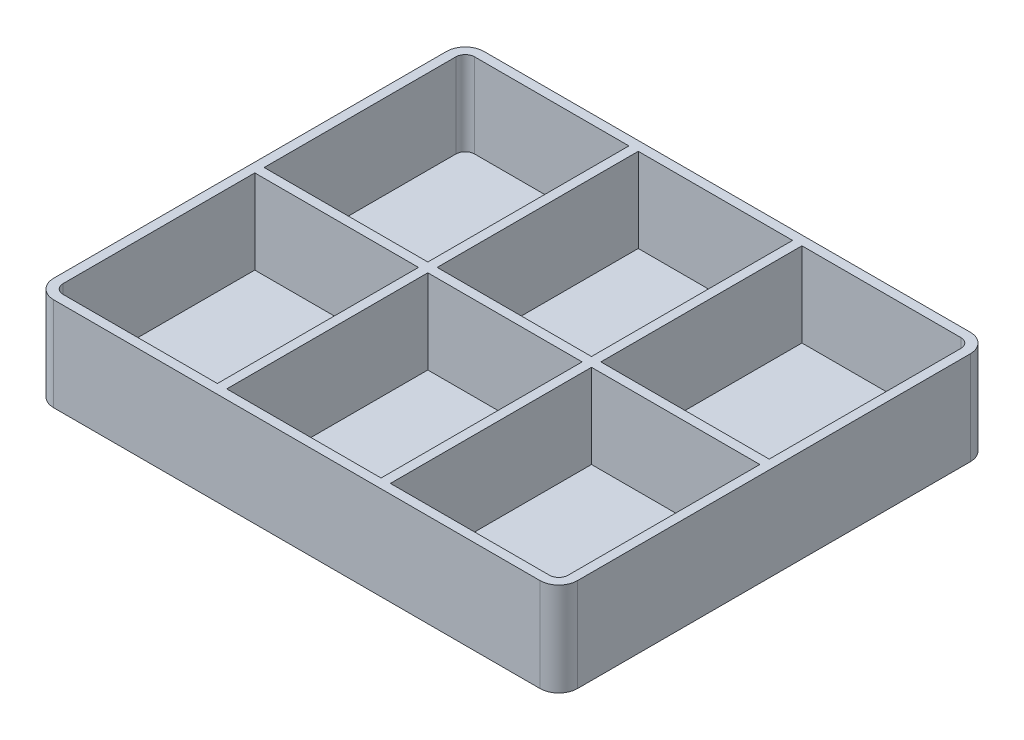
ISO-10303-21;
HEADER;
FILE_DESCRIPTION(('STEP AP214'),'2;1');
FILE_NAME('part.step','',(''),(''),'','','');
FILE_SCHEMA(('AUTOMOTIVE_DESIGN { 1 0 10303 214 1 1 1 1 }'));
ENDSEC;
DATA;
#1=APPLICATION_CONTEXT('core data for automotive mechanical design processes');
#2=APPLICATION_PROTOCOL_DEFINITION('international standard','automotive_design',2000,#1);
#3=PRODUCT_CONTEXT('',#1,'mechanical');
#4=PRODUCT('Part','Part','',(#3));
#5=PRODUCT_RELATED_PRODUCT_CATEGORY('part','',(#4));
#6=PRODUCT_DEFINITION_FORMATION('','',#4);
#7=PRODUCT_DEFINITION_CONTEXT('part definition',#1,'design');
#8=PRODUCT_DEFINITION('design','',#6,#7);
#9=PRODUCT_DEFINITION_SHAPE('','',#8);
#10=(LENGTH_UNIT() NAMED_UNIT(*) SI_UNIT(.MILLI.,.METRE.));
#11=(NAMED_UNIT(*) PLANE_ANGLE_UNIT() SI_UNIT($,.RADIAN.));
#12=(NAMED_UNIT(*) SI_UNIT($,.STERADIAN.) SOLID_ANGLE_UNIT());
#13=UNCERTAINTY_MEASURE_WITH_UNIT(LENGTH_MEASURE(1.E-05),#10,'distance_accuracy_value','');
#14=(GEOMETRIC_REPRESENTATION_CONTEXT(3) GLOBAL_UNCERTAINTY_ASSIGNED_CONTEXT((#13)) GLOBAL_UNIT_ASSIGNED_CONTEXT((#10,
#11,#12)) REPRESENTATION_CONTEXT('',''));
#15=CARTESIAN_POINT('',(0.,0.,0.));
#16=DIRECTION('',(0.,0.,1.));
#17=DIRECTION('',(1.,0.,0.));
#18=AXIS2_PLACEMENT_3D('',#15,#16,#17);
#19=CARTESIAN_POINT('',(10.0000000000001,50.,-225.));
#20=DIRECTION('',(0.,0.,1.));
#21=DIRECTION('',(1.,0.,0.));
#22=AXIS2_PLACEMENT_3D('',#19,#20,#21);
#23=PLANE('',#22);
#24=DIRECTION('',(-1.,0.,0.));
#25=VECTOR('',#24,1.);
#26=CARTESIAN_POINT('',(270.,50.,-225.));
#27=LINE('',#26,#25);
#28=CARTESIAN_POINT('',(270.,50.,-225.));
#29=VERTEX_POINT('',#28);
#30=CARTESIAN_POINT('',(185.,50.,-225.));
#31=VERTEX_POINT('',#30);
#32=EDGE_CURVE('E447',#29,#31,#27,.T.);
#33=ORIENTED_EDGE('',*,*,#32,.T.);
#34=DIRECTION('',(0.,-1.,0.));
#35=VECTOR('',#34,1.);
#36=CARTESIAN_POINT('',(185.,50.,-225.));
#37=LINE('',#36,#35);
#38=CARTESIAN_POINT('',(185.,5.,-225.));
#39=VERTEX_POINT('',#38);
#40=EDGE_CURVE('E655',#31,#39,#37,.T.);
#41=ORIENTED_EDGE('',*,*,#40,.T.);
#42=DIRECTION('',(-1.,0.,0.));
#43=VECTOR('',#42,1.);
#44=CARTESIAN_POINT('',(270.,5.,-225.));
#45=LINE('',#44,#43);
#46=CARTESIAN_POINT('',(270.,5.,-225.));
#47=VERTEX_POINT('',#46);
#48=EDGE_CURVE('E406',#47,#39,#45,.T.);
#49=ORIENTED_EDGE('',*,*,#48,.F.);
#50=DIRECTION('',(0.,1.,0.));
#51=VECTOR('',#50,1.);
#52=CARTESIAN_POINT('',(270.,50.,-225.));
#53=LINE('',#52,#51);
#54=EDGE_CURVE('E396',#29,#47,#53,.F.);
#55=ORIENTED_EDGE('',*,*,#54,.F.);
#56=EDGE_LOOP('',(#33,#41,#49,#55));
#57=FACE_BOUND('',#56,.T.);
#58=ADVANCED_FACE('F87',(#57),#23,.T.);
#59=DIRECTION('',(0.,-1.,0.));
#60=VECTOR('',#59,1.);
#61=CARTESIAN_POINT('',(180.,50.,-225.));
#62=LINE('',#61,#60);
#63=CARTESIAN_POINT('',(180.,50.,-225.));
#64=VERTEX_POINT('',#63);
#65=CARTESIAN_POINT('',(180.,5.,-225.));
#66=VERTEX_POINT('',#65);
#67=EDGE_CURVE('E651',#64,#66,#62,.T.);
#68=ORIENTED_EDGE('',*,*,#67,.F.);
#69=CARTESIAN_POINT('',(97.5,50.,-225.));
#70=VERTEX_POINT('',#69);
#71=EDGE_CURVE('E110',#64,#70,#27,.T.);
#72=ORIENTED_EDGE('',*,*,#71,.T.);
#73=DIRECTION('',(0.,-1.,0.));
#74=VECTOR('',#73,1.);
#75=CARTESIAN_POINT('',(97.5,50.,-225.));
#76=LINE('',#75,#74);
#77=CARTESIAN_POINT('',(97.5,5.,-225.));
#78=VERTEX_POINT('',#77);
#79=EDGE_CURVE('E682',#70,#78,#76,.T.);
#80=ORIENTED_EDGE('',*,*,#79,.T.);
#81=EDGE_CURVE('E410',#66,#78,#45,.T.);
#82=ORIENTED_EDGE('',*,*,#81,.F.);
#83=EDGE_LOOP('',(#68,#72,#80,#82));
#84=FACE_BOUND('',#83,.T.);
#85=ADVANCED_FACE('F567',(#84),#23,.T.);
#86=CARTESIAN_POINT('',(5.,50.,-10.0000000000001));
#87=DIRECTION('',(1.,0.,0.));
#88=DIRECTION('',(0.,0.,-1.));
#89=AXIS2_PLACEMENT_3D('',#86,#87,#88);
#90=PLANE('',#89);
#91=DIRECTION('',(0.,0.,1.));
#92=VECTOR('',#91,1.);
#93=CARTESIAN_POINT('',(5.,5.,-220.));
#94=LINE('',#93,#92);
#95=CARTESIAN_POINT('',(5.,5.,-112.5));
#96=VERTEX_POINT('',#95);
#97=CARTESIAN_POINT('',(5.,5.,-10.));
#98=VERTEX_POINT('',#97);
#99=EDGE_CURVE('E415',#96,#98,#94,.T.);
#100=ORIENTED_EDGE('',*,*,#99,.F.);
#101=DIRECTION('',(0.,-1.,0.));
#102=VECTOR('',#101,1.);
#103=CARTESIAN_POINT('',(4.99999999999999,50.,-112.5));
#104=LINE('',#103,#102);
#105=CARTESIAN_POINT('',(5.,50.,-112.5));
#106=VERTEX_POINT('',#105);
#107=EDGE_CURVE('E369',#106,#96,#104,.T.);
#108=ORIENTED_EDGE('',*,*,#107,.F.);
#109=DIRECTION('',(0.,0.,1.));
#110=VECTOR('',#109,1.);
#111=CARTESIAN_POINT('',(5.,50.,-220.));
#112=LINE('',#111,#110);
#113=CARTESIAN_POINT('',(5.,50.,-10.0000000000001));
#114=VERTEX_POINT('',#113);
#115=EDGE_CURVE('E451',#106,#114,#112,.T.);
#116=ORIENTED_EDGE('',*,*,#115,.T.);
#117=DIRECTION('',(0.,-1.,0.));
#118=VECTOR('',#117,1.);
#119=CARTESIAN_POINT('',(5.,50.,-10.));
#120=LINE('',#119,#118);
#121=EDGE_CURVE('E418',#114,#98,#120,.T.);
#122=ORIENTED_EDGE('',*,*,#121,.T.);
#123=EDGE_LOOP('',(#100,#108,#116,#122));
#124=FACE_BOUND('',#123,.T.);
#125=ADVANCED_FACE('F574',(#124),#90,.T.);
#126=CARTESIAN_POINT('',(10.0000000000001,50.,-5.));
#127=DIRECTION('',(0.,0.,-1.));
#128=DIRECTION('',(-1.,0.,0.));
#129=AXIS2_PLACEMENT_3D('',#126,#127,#128);
#130=PLANE('',#129);
#131=DIRECTION('',(1.,0.,0.));
#132=VECTOR('',#131,1.);
#133=CARTESIAN_POINT('',(270.,5.,-5.));
#134=LINE('',#133,#132);
#135=CARTESIAN_POINT('',(185.,5.,-5.));
#136=VERTEX_POINT('',#135);
#137=CARTESIAN_POINT('',(270.,5.,-4.99999999999999));
#138=VERTEX_POINT('',#137);
#139=EDGE_CURVE('E427',#136,#138,#134,.T.);
#140=ORIENTED_EDGE('',*,*,#139,.F.);
#141=DIRECTION('',(0.,-1.,0.));
#142=VECTOR('',#141,1.);
#143=CARTESIAN_POINT('',(185.,50.,-5.));
#144=LINE('',#143,#142);
#145=CARTESIAN_POINT('',(185.,50.,-5.));
#146=VERTEX_POINT('',#145);
#147=EDGE_CURVE('E663',#146,#136,#144,.T.);
#148=ORIENTED_EDGE('',*,*,#147,.F.);
#149=DIRECTION('',(1.,0.,0.));
#150=VECTOR('',#149,1.);
#151=CARTESIAN_POINT('',(270.,50.,-5.));
#152=LINE('',#151,#150);
#153=CARTESIAN_POINT('',(270.,50.,-5.));
#154=VERTEX_POINT('',#153);
#155=EDGE_CURVE('E456',#146,#154,#152,.T.);
#156=ORIENTED_EDGE('',*,*,#155,.T.);
#157=DIRECTION('',(0.,-1.,0.));
#158=VECTOR('',#157,1.);
#159=CARTESIAN_POINT('',(270.,50.,-4.99999999999999));
#160=LINE('',#159,#158);
#161=EDGE_CURVE('E430',#154,#138,#160,.T.);
#162=ORIENTED_EDGE('',*,*,#161,.T.);
#163=EDGE_LOOP('',(#140,#148,#156,#162));
#164=FACE_BOUND('',#163,.T.);
#165=ADVANCED_FACE('F705',(#164),#130,.T.);
#166=DIRECTION('',(0.,-1.,0.));
#167=VECTOR('',#166,1.);
#168=CARTESIAN_POINT('',(180.,50.,-5.));
#169=LINE('',#168,#167);
#170=CARTESIAN_POINT('',(180.,50.,-5.));
#171=VERTEX_POINT('',#170);
#172=CARTESIAN_POINT('',(180.,5.,-5.));
#173=VERTEX_POINT('',#172);
#174=EDGE_CURVE('E386',#171,#173,#169,.T.);
#175=ORIENTED_EDGE('',*,*,#174,.T.);
#176=CARTESIAN_POINT('',(97.5,5.,-5.));
#177=VERTEX_POINT('',#176);
#178=EDGE_CURVE('E328',#177,#173,#134,.T.);
#179=ORIENTED_EDGE('',*,*,#178,.F.);
#180=DIRECTION('',(0.,-1.,0.));
#181=VECTOR('',#180,1.);
#182=CARTESIAN_POINT('',(97.5,50.,-4.99999999999999));
#183=LINE('',#182,#181);
#184=CARTESIAN_POINT('',(97.5,50.,-5.));
#185=VERTEX_POINT('',#184);
#186=EDGE_CURVE('E377',#185,#177,#183,.T.);
#187=ORIENTED_EDGE('',*,*,#186,.F.);
#188=EDGE_CURVE('E460',#185,#171,#152,.T.);
#189=ORIENTED_EDGE('',*,*,#188,.T.);
#190=EDGE_LOOP('',(#175,#179,#187,#189));
#191=FACE_BOUND('',#190,.T.);
#192=ADVANCED_FACE('F698',(#191),#130,.T.);
#193=CARTESIAN_POINT('',(275.,50.,-10.0000000000001));
#194=DIRECTION('',(-1.,0.,0.));
#195=DIRECTION('',(0.,0.,1.));
#196=AXIS2_PLACEMENT_3D('',#193,#194,#195);
#197=PLANE('',#196);
#198=DIRECTION('',(0.,0.,-1.));
#199=VECTOR('',#198,1.);
#200=CARTESIAN_POINT('',(275.,50.,-220.));
#201=LINE('',#200,#199);
#202=CARTESIAN_POINT('',(275.,50.,-10.));
#203=VERTEX_POINT('',#202);
#204=CARTESIAN_POINT('',(275.,50.,-112.5));
#205=VERTEX_POINT('',#204);
#206=EDGE_CURVE('E405',#203,#205,#201,.T.);
#207=ORIENTED_EDGE('',*,*,#206,.T.);
#208=DIRECTION('',(0.,-1.,0.));
#209=VECTOR('',#208,1.);
#210=CARTESIAN_POINT('',(275.,50.,-112.5));
#211=LINE('',#210,#209);
#212=CARTESIAN_POINT('',(275.,5.,-112.5));
#213=VERTEX_POINT('',#212);
#214=EDGE_CURVE('E367',#205,#213,#211,.T.);
#215=ORIENTED_EDGE('',*,*,#214,.T.);
#216=DIRECTION('',(0.,0.,-1.));
#217=VECTOR('',#216,1.);
#218=CARTESIAN_POINT('',(275.,5.,-220.));
#219=LINE('',#218,#217);
#220=CARTESIAN_POINT('',(275.,5.,-10.0000000000001));
#221=VERTEX_POINT('',#220);
#222=EDGE_CURVE('E441',#221,#213,#219,.T.);
#223=ORIENTED_EDGE('',*,*,#222,.F.);
#224=DIRECTION('',(0.,1.,0.));
#225=VECTOR('',#224,1.);
#226=CARTESIAN_POINT('',(275.,50.,-10.0000000000001));
#227=LINE('',#226,#225);
#228=EDGE_CURVE('E404',#203,#221,#227,.F.);
#229=ORIENTED_EDGE('',*,*,#228,.F.);
#230=EDGE_LOOP('',(#207,#215,#223,#229));
#231=FACE_BOUND('',#230,.T.);
#232=ADVANCED_FACE('F710',(#231),#197,.T.);
#233=CARTESIAN_POINT('',(270.,5.,-220.));
#234=DIRECTION('',(0.,-1.,0.));
#235=DIRECTION('',(0.,0.,-1.));
#236=AXIS2_PLACEMENT_3D('',#233,#234,#235);
#237=PLANE('',#236);
#238=DIRECTION('',(0.,0.,-1.));
#239=VECTOR('',#238,1.);
#240=CARTESIAN_POINT('',(185.,5.,0.));
#241=LINE('',#240,#239);
#242=CARTESIAN_POINT('',(185.,5.,-117.5));
#243=VERTEX_POINT('',#242);
#244=EDGE_CURVE('E331',#243,#39,#241,.T.);
#245=ORIENTED_EDGE('',*,*,#244,.F.);
#246=DIRECTION('',(1.,0.,0.));
#247=VECTOR('',#246,1.);
#248=CARTESIAN_POINT('',(4.99999999999999,5.,-117.5));
#249=LINE('',#248,#247);
#250=CARTESIAN_POINT('',(275.,5.,-117.5));
#251=VERTEX_POINT('',#250);
#252=EDGE_CURVE('E352',#243,#251,#249,.T.);
#253=ORIENTED_EDGE('',*,*,#252,.T.);
#254=CARTESIAN_POINT('',(275.,5.,-220.));
#255=VERTEX_POINT('',#254);
#256=EDGE_CURVE('E438',#251,#255,#219,.T.);
#257=ORIENTED_EDGE('',*,*,#256,.T.);
#258=CARTESIAN_POINT('',(270.,5.,-220.));
#259=DIRECTION('',(0.,-1.,0.));
#260=DIRECTION('',(0.,0.,-1.));
#261=AXIS2_PLACEMENT_3D('',#258,#259,#260);
#262=CIRCLE('',#261,5.00000000000001);
#263=EDGE_CURVE('E392',#255,#47,#262,.F.);
#264=ORIENTED_EDGE('',*,*,#263,.T.);
#265=ORIENTED_EDGE('',*,*,#48,.T.);
#266=EDGE_LOOP('',(#245,#253,#257,#264,#265));
#267=FACE_BOUND('',#266,.T.);
#268=ADVANCED_FACE('F627',(#267),#237,.F.);
#269=CARTESIAN_POINT('',(185.,5.,-112.5));
#270=VERTEX_POINT('',#269);
#271=EDGE_CURVE('E641',#136,#270,#241,.T.);
#272=ORIENTED_EDGE('',*,*,#271,.F.);
#273=ORIENTED_EDGE('',*,*,#139,.T.);
#274=CARTESIAN_POINT('',(270.,5.,-10.));
#275=DIRECTION('',(0.,-1.,0.));
#276=DIRECTION('',(0.,0.,-1.));
#277=AXIS2_PLACEMENT_3D('',#274,#275,#276);
#278=CIRCLE('',#277,5.);
#279=EDGE_CURVE('E434',#138,#221,#278,.F.);
#280=ORIENTED_EDGE('',*,*,#279,.T.);
#281=ORIENTED_EDGE('',*,*,#222,.T.);
#282=DIRECTION('',(1.,0.,0.));
#283=VECTOR('',#282,1.);
#284=CARTESIAN_POINT('',(4.99999999999999,5.,-112.5));
#285=LINE('',#284,#283);
#286=EDGE_CURVE('E349',#270,#213,#285,.T.);
#287=ORIENTED_EDGE('',*,*,#286,.F.);
#288=EDGE_LOOP('',(#272,#273,#280,#281,#287));
#289=FACE_BOUND('',#288,.T.);
#290=ADVANCED_FACE('F701',(#289),#237,.F.);
#291=CARTESIAN_POINT('',(92.5,5.,-112.5));
#292=VERTEX_POINT('',#291);
#293=EDGE_CURVE('E348',#96,#292,#285,.T.);
#294=ORIENTED_EDGE('',*,*,#293,.F.);
#295=ORIENTED_EDGE('',*,*,#99,.T.);
#296=CARTESIAN_POINT('',(10.,5.,-10.));
#297=DIRECTION('',(0.,-1.,0.));
#298=DIRECTION('',(0.,0.,-1.));
#299=AXIS2_PLACEMENT_3D('',#296,#297,#298);
#300=CIRCLE('',#299,5.);
#301=CARTESIAN_POINT('',(10.0000000000001,5.,-5.));
#302=VERTEX_POINT('',#301);
#303=EDGE_CURVE('E422',#98,#302,#300,.F.);
#304=ORIENTED_EDGE('',*,*,#303,.T.);
#305=CARTESIAN_POINT('',(92.5,5.,-5.));
#306=VERTEX_POINT('',#305);
#307=EDGE_CURVE('E431',#302,#306,#134,.T.);
#308=ORIENTED_EDGE('',*,*,#307,.T.);
#309=DIRECTION('',(0.,0.,-1.));
#310=VECTOR('',#309,1.);
#311=CARTESIAN_POINT('',(92.5,5.,-4.99999999999999));
#312=LINE('',#311,#310);
#313=EDGE_CURVE('E678',#306,#292,#312,.T.);
#314=ORIENTED_EDGE('',*,*,#313,.T.);
#315=EDGE_LOOP('',(#294,#295,#304,#308,#314));
#316=FACE_BOUND('',#315,.T.);
#317=ADVANCED_FACE('F769',(#316),#237,.F.);
#318=CARTESIAN_POINT('',(5.,5.,-117.5));
#319=VERTEX_POINT('',#318);
#320=CARTESIAN_POINT('',(92.5,5.,-117.5));
#321=VERTEX_POINT('',#320);
#322=EDGE_CURVE('E358',#319,#321,#249,.T.);
#323=ORIENTED_EDGE('',*,*,#322,.T.);
#324=CARTESIAN_POINT('',(92.5,5.,-225.));
#325=VERTEX_POINT('',#324);
#326=EDGE_CURVE('E677',#321,#325,#312,.T.);
#327=ORIENTED_EDGE('',*,*,#326,.T.);
#328=CARTESIAN_POINT('',(10.,5.,-225.));
#329=VERTEX_POINT('',#328);
#330=EDGE_CURVE('E395',#325,#329,#45,.T.);
#331=ORIENTED_EDGE('',*,*,#330,.T.);
#332=CARTESIAN_POINT('',(10.,5.,-220.));
#333=DIRECTION('',(0.,-1.,0.));
#334=DIRECTION('',(0.,0.,-1.));
#335=AXIS2_PLACEMENT_3D('',#332,#333,#334);
#336=CIRCLE('',#335,5.);
#337=CARTESIAN_POINT('',(5.,5.,-220.));
#338=VERTEX_POINT('',#337);
#339=EDGE_CURVE('E409',#329,#338,#336,.F.);
#340=ORIENTED_EDGE('',*,*,#339,.T.);
#341=EDGE_CURVE('E419',#338,#319,#94,.T.);
#342=ORIENTED_EDGE('',*,*,#341,.T.);
#343=EDGE_LOOP('',(#323,#327,#331,#340,#342));
#344=FACE_BOUND('',#343,.T.);
#345=ADVANCED_FACE('F767',(#344),#237,.F.);
#346=CARTESIAN_POINT('',(97.5,5.,-117.5));
#347=VERTEX_POINT('',#346);
#348=CARTESIAN_POINT('',(180.,5.,-117.5));
#349=VERTEX_POINT('',#348);
#350=EDGE_CURVE('E361',#347,#349,#249,.T.);
#351=ORIENTED_EDGE('',*,*,#350,.T.);
#352=DIRECTION('',(0.,0.,-1.));
#353=VECTOR('',#352,1.);
#354=CARTESIAN_POINT('',(180.,5.,0.));
#355=LINE('',#354,#353);
#356=EDGE_CURVE('E332',#349,#66,#355,.T.);
#357=ORIENTED_EDGE('',*,*,#356,.T.);
#358=ORIENTED_EDGE('',*,*,#81,.T.);
#359=DIRECTION('',(0.,0.,-1.));
#360=VECTOR('',#359,1.);
#361=CARTESIAN_POINT('',(97.5,5.,-4.99999999999999));
#362=LINE('',#361,#360);
#363=EDGE_CURVE('E372',#347,#78,#362,.T.);
#364=ORIENTED_EDGE('',*,*,#363,.F.);
#365=EDGE_LOOP('',(#351,#357,#358,#364));
#366=FACE_BOUND('',#365,.T.);
#367=ADVANCED_FACE('F628',(#366),#237,.F.);
#368=CARTESIAN_POINT('',(270.,50.,-220.));
#369=DIRECTION('',(0.,-1.,0.));
#370=DIRECTION('',(0.,0.,-1.));
#371=AXIS2_PLACEMENT_3D('',#368,#369,#370);
#372=PLANE('',#371);
#373=ORIENTED_EDGE('',*,*,#71,.F.);
#374=DIRECTION('',(0.,0.,-1.));
#375=VECTOR('',#374,1.);
#376=CARTESIAN_POINT('',(180.,50.,0.));
#377=LINE('',#376,#375);
#378=CARTESIAN_POINT('',(180.,50.,-117.5));
#379=VERTEX_POINT('',#378);
#380=EDGE_CURVE('E660',#379,#64,#377,.T.);
#381=ORIENTED_EDGE('',*,*,#380,.F.);
#382=DIRECTION('',(1.,0.,0.));
#383=VECTOR('',#382,1.);
#384=CARTESIAN_POINT('',(4.99999999999999,50.,-117.5));
#385=LINE('',#384,#383);
#386=CARTESIAN_POINT('',(97.5,50.,-117.5));
#387=VERTEX_POINT('',#386);
#388=EDGE_CURVE('E692',#387,#379,#385,.T.);
#389=ORIENTED_EDGE('',*,*,#388,.F.);
#390=DIRECTION('',(0.,0.,-1.));
#391=VECTOR('',#390,1.);
#392=CARTESIAN_POINT('',(97.5,50.,-4.99999999999999));
#393=LINE('',#392,#391);
#394=EDGE_CURVE('E670',#387,#70,#393,.T.);
#395=ORIENTED_EDGE('',*,*,#394,.T.);
#396=EDGE_LOOP('',(#373,#381,#389,#395));
#397=FACE_BOUND('',#396,.T.);
#398=DIRECTION('',(0.,0.,-1.));
#399=VECTOR('',#398,1.);
#400=CARTESIAN_POINT('',(185.,50.,0.));
#401=LINE('',#400,#399);
#402=CARTESIAN_POINT('',(185.,50.,-117.5));
#403=VERTEX_POINT('',#402);
#404=EDGE_CURVE('E652',#403,#31,#401,.T.);
#405=ORIENTED_EDGE('',*,*,#404,.T.);
#406=ORIENTED_EDGE('',*,*,#32,.F.);
#407=CARTESIAN_POINT('',(270.,50.,-220.));
#408=DIRECTION('',(0.,-1.,0.));
#409=DIRECTION('',(0.,0.,-1.));
#410=AXIS2_PLACEMENT_3D('',#407,#408,#409);
#411=CIRCLE('',#410,5.00000000000001);
#412=CARTESIAN_POINT('',(275.,50.,-220.));
#413=VERTEX_POINT('',#412);
#414=EDGE_CURVE('E444',#413,#29,#411,.F.);
#415=ORIENTED_EDGE('',*,*,#414,.F.);
#416=CARTESIAN_POINT('',(275.,50.,-117.5));
#417=VERTEX_POINT('',#416);
#418=EDGE_CURVE('E463',#417,#413,#201,.T.);
#419=ORIENTED_EDGE('',*,*,#418,.F.);
#420=EDGE_CURVE('E686',#403,#417,#385,.T.);
#421=ORIENTED_EDGE('',*,*,#420,.F.);
#422=EDGE_LOOP('',(#405,#406,#415,#419,#421));
#423=FACE_BOUND('',#422,.T.);
#424=ORIENTED_EDGE('',*,*,#115,.F.);
#425=DIRECTION('',(1.,0.,0.));
#426=VECTOR('',#425,1.);
#427=CARTESIAN_POINT('',(4.99999999999999,50.,-112.5));
#428=LINE('',#427,#426);
#429=CARTESIAN_POINT('',(92.5,50.,-112.5));
#430=VERTEX_POINT('',#429);
#431=EDGE_CURVE('E648',#106,#430,#428,.T.);
#432=ORIENTED_EDGE('',*,*,#431,.T.);
#433=DIRECTION('',(0.,0.,-1.));
#434=VECTOR('',#433,1.);
#435=CARTESIAN_POINT('',(92.5,50.,-4.99999999999999));
#436=LINE('',#435,#434);
#437=CARTESIAN_POINT('',(92.5,50.,-5.));
#438=VERTEX_POINT('',#437);
#439=EDGE_CURVE('E671',#438,#430,#436,.T.);
#440=ORIENTED_EDGE('',*,*,#439,.F.);
#441=CARTESIAN_POINT('',(10.,50.,-5.));
#442=VERTEX_POINT('',#441);
#443=EDGE_CURVE('E457',#442,#438,#152,.T.);
#444=ORIENTED_EDGE('',*,*,#443,.F.);
#445=CARTESIAN_POINT('',(10.,50.,-10.));
#446=DIRECTION('',(0.,-1.,0.));
#447=DIRECTION('',(0.,0.,-1.));
#448=AXIS2_PLACEMENT_3D('',#445,#446,#447);
#449=CIRCLE('',#448,5.);
#450=EDGE_CURVE('E454',#114,#442,#449,.F.);
#451=ORIENTED_EDGE('',*,*,#450,.F.);
#452=EDGE_LOOP('',(#424,#432,#440,#444,#451));
#453=FACE_BOUND('',#452,.T.);
#454=ORIENTED_EDGE('',*,*,#188,.F.);
#455=CARTESIAN_POINT('',(97.5,50.,-112.5));
#456=VERTEX_POINT('',#455);
#457=EDGE_CURVE('E666',#185,#456,#393,.T.);
#458=ORIENTED_EDGE('',*,*,#457,.T.);
#459=CARTESIAN_POINT('',(180.,50.,-112.5));
#460=VERTEX_POINT('',#459);
#461=EDGE_CURVE('E647',#456,#460,#428,.T.);
#462=ORIENTED_EDGE('',*,*,#461,.T.);
#463=EDGE_CURVE('E338',#171,#460,#377,.T.);
#464=ORIENTED_EDGE('',*,*,#463,.F.);
#465=EDGE_LOOP('',(#454,#458,#462,#464));
#466=FACE_BOUND('',#465,.T.);
#467=ORIENTED_EDGE('',*,*,#155,.F.);
#468=CARTESIAN_POINT('',(185.,50.,-112.5));
#469=VERTEX_POINT('',#468);
#470=EDGE_CURVE('E640',#146,#469,#401,.T.);
#471=ORIENTED_EDGE('',*,*,#470,.T.);
#472=EDGE_CURVE('E360',#469,#205,#428,.T.);
#473=ORIENTED_EDGE('',*,*,#472,.T.);
#474=ORIENTED_EDGE('',*,*,#206,.F.);
#475=CARTESIAN_POINT('',(270.,50.,-10.));
#476=DIRECTION('',(0.,-1.,0.));
#477=DIRECTION('',(0.,0.,-1.));
#478=AXIS2_PLACEMENT_3D('',#475,#476,#477);
#479=CIRCLE('',#478,5.);
#480=EDGE_CURVE('E459',#154,#203,#479,.F.);
#481=ORIENTED_EDGE('',*,*,#480,.F.);
#482=EDGE_LOOP('',(#467,#471,#473,#474,#481));
#483=FACE_BOUND('',#482,.T.);
#484=CARTESIAN_POINT('',(270.,50.,-220.));
#485=DIRECTION('',(0.,1.,0.));
#486=DIRECTION('',(0.,0.,-1.));
#487=AXIS2_PLACEMENT_3D('',#484,#485,#486);
#488=CIRCLE('',#487,10.);
#489=CARTESIAN_POINT('',(280.,50.,-220.));
#490=VERTEX_POINT('',#489);
#491=CARTESIAN_POINT('',(270.,50.,-230.));
#492=VERTEX_POINT('',#491);
#493=EDGE_CURVE('E465',#490,#492,#488,.T.);
#494=ORIENTED_EDGE('',*,*,#493,.T.);
#495=DIRECTION('',(-1.,0.,0.));
#496=VECTOR('',#495,1.);
#497=CARTESIAN_POINT('',(10.0000000000001,50.,-230.));
#498=LINE('',#497,#496);
#499=CARTESIAN_POINT('',(10.0000000000001,50.,-230.));
#500=VERTEX_POINT('',#499);
#501=EDGE_CURVE('E468',#492,#500,#498,.T.);
#502=ORIENTED_EDGE('',*,*,#501,.T.);
#503=CARTESIAN_POINT('',(10.,50.,-220.));
#504=DIRECTION('',(0.,1.,0.));
#505=DIRECTION('',(0.,0.,-1.));
#506=AXIS2_PLACEMENT_3D('',#503,#504,#505);
#507=CIRCLE('',#506,10.);
#508=CARTESIAN_POINT('',(0.,50.,-220.));
#509=VERTEX_POINT('',#508);
#510=EDGE_CURVE('E471',#500,#509,#507,.T.);
#511=ORIENTED_EDGE('',*,*,#510,.T.);
#512=DIRECTION('',(0.,0.,1.));
#513=VECTOR('',#512,1.);
#514=CARTESIAN_POINT('',(0.,50.,-10.0000000000001));
#515=LINE('',#514,#513);
#516=CARTESIAN_POINT('',(0.,50.,-10.0000000000001));
#517=VERTEX_POINT('',#516);
#518=EDGE_CURVE('E473',#509,#517,#515,.T.);
#519=ORIENTED_EDGE('',*,*,#518,.T.);
#520=CARTESIAN_POINT('',(10.,50.,-10.));
#521=DIRECTION('',(0.,1.,0.));
#522=DIRECTION('',(0.,0.,-1.));
#523=AXIS2_PLACEMENT_3D('',#520,#521,#522);
#524=CIRCLE('',#523,10.);
#525=CARTESIAN_POINT('',(10.0000000000001,50.,0.));
#526=VERTEX_POINT('',#525);
#527=EDGE_CURVE('E475',#517,#526,#524,.T.);
#528=ORIENTED_EDGE('',*,*,#527,.T.);
#529=DIRECTION('',(1.,0.,0.));
#530=VECTOR('',#529,1.);
#531=CARTESIAN_POINT('',(10.0000000000001,50.,0.));
#532=LINE('',#531,#530);
#533=CARTESIAN_POINT('',(270.,50.,0.));
#534=VERTEX_POINT('',#533);
#535=EDGE_CURVE('E477',#526,#534,#532,.T.);
#536=ORIENTED_EDGE('',*,*,#535,.T.);
#537=CARTESIAN_POINT('',(270.,50.,-10.));
#538=DIRECTION('',(0.,1.,0.));
#539=DIRECTION('',(0.,0.,1.));
#540=AXIS2_PLACEMENT_3D('',#537,#538,#539);
#541=CIRCLE('',#540,10.);
#542=CARTESIAN_POINT('',(280.,50.,-10.0000000000001));
#543=VERTEX_POINT('',#542);
#544=EDGE_CURVE('E479',#534,#543,#541,.T.);
#545=ORIENTED_EDGE('',*,*,#544,.T.);
#546=DIRECTION('',(0.,0.,-1.));
#547=VECTOR('',#546,1.);
#548=CARTESIAN_POINT('',(280.,50.,-10.0000000000001));
#549=LINE('',#548,#547);
#550=EDGE_CURVE('E481',#543,#490,#549,.T.);
#551=ORIENTED_EDGE('',*,*,#550,.T.);
#552=EDGE_LOOP('',(#494,#502,#511,#519,#528,#536,#545,#551));
#553=FACE_BOUND('',#552,.T.);
#554=CARTESIAN_POINT('',(92.5,50.,-225.));
#555=VERTEX_POINT('',#554);
#556=CARTESIAN_POINT('',(10.0000000000001,50.,-225.));
#557=VERTEX_POINT('',#556);
#558=EDGE_CURVE('E446',#555,#557,#27,.T.);
#559=ORIENTED_EDGE('',*,*,#558,.F.);
#560=CARTESIAN_POINT('',(92.5,50.,-117.5));
#561=VERTEX_POINT('',#560);
#562=EDGE_CURVE('E669',#561,#555,#436,.T.);
#563=ORIENTED_EDGE('',*,*,#562,.F.);
#564=CARTESIAN_POINT('',(5.,50.,-117.5));
#565=VERTEX_POINT('',#564);
#566=EDGE_CURVE('E356',#565,#561,#385,.T.);
#567=ORIENTED_EDGE('',*,*,#566,.F.);
#568=CARTESIAN_POINT('',(4.99999999999999,50.,-220.));
#569=VERTEX_POINT('',#568);
#570=EDGE_CURVE('E452',#569,#565,#112,.T.);
#571=ORIENTED_EDGE('',*,*,#570,.F.);
#572=CARTESIAN_POINT('',(10.,50.,-220.));
#573=DIRECTION('',(0.,-1.,0.));
#574=DIRECTION('',(0.,0.,-1.));
#575=AXIS2_PLACEMENT_3D('',#572,#573,#574);
#576=CIRCLE('',#575,5.);
#577=EDGE_CURVE('E449',#557,#569,#576,.F.);
#578=ORIENTED_EDGE('',*,*,#577,.F.);
#579=EDGE_LOOP('',(#559,#563,#567,#571,#578));
#580=FACE_BOUND('',#579,.T.);
#581=ADVANCED_FACE('F539',(#397,#423,#453,#466,#483,#553,#580),#372,.F.);
#582=CARTESIAN_POINT('',(270.,50.,-220.));
#583=DIRECTION('',(0.,-1.,0.));
#584=DIRECTION('',(0.,0.,-1.));
#585=AXIS2_PLACEMENT_3D('',#582,#583,#584);
#586=CYLINDRICAL_SURFACE('',#585,10.);
#587=CARTESIAN_POINT('',(270.,0.,-220.));
#588=DIRECTION('',(0.,1.,0.));
#589=DIRECTION('',(0.,0.,-1.));
#590=AXIS2_PLACEMENT_3D('',#587,#588,#589);
#591=CIRCLE('',#590,10.);
#592=CARTESIAN_POINT('',(280.,0.,-220.));
#593=VERTEX_POINT('',#592);
#594=CARTESIAN_POINT('',(270.,0.,-230.));
#595=VERTEX_POINT('',#594);
#596=EDGE_CURVE('E399',#593,#595,#591,.T.);
#597=ORIENTED_EDGE('',*,*,#596,.T.);
#598=DIRECTION('',(0.,-1.,0.));
#599=VECTOR('',#598,1.);
#600=CARTESIAN_POINT('',(270.,50.,-230.));
#601=LINE('',#600,#599);
#602=EDGE_CURVE('E12',#492,#595,#601,.T.);
#603=ORIENTED_EDGE('',*,*,#602,.F.);
#604=ORIENTED_EDGE('',*,*,#493,.F.);
#605=DIRECTION('',(0.,-1.,0.));
#606=VECTOR('',#605,1.);
#607=CARTESIAN_POINT('',(280.,50.,-220.));
#608=LINE('',#607,#606);
#609=EDGE_CURVE('E483',#490,#593,#608,.T.);
#610=ORIENTED_EDGE('',*,*,#609,.T.);
#611=EDGE_LOOP('',(#597,#603,#604,#610));
#612=FACE_BOUND('',#611,.T.);
#613=ADVANCED_FACE('F89',(#612),#586,.T.);
#614=CARTESIAN_POINT('',(10.0000000000001,50.,-230.));
#615=DIRECTION('',(0.,0.,1.));
#616=DIRECTION('',(1.,0.,0.));
#617=AXIS2_PLACEMENT_3D('',#614,#615,#616);
#618=PLANE('',#617);
#619=DIRECTION('',(-1.,0.,0.));
#620=VECTOR('',#619,1.);
#621=CARTESIAN_POINT('',(10.0000000000001,0.,-230.));
#622=LINE('',#621,#620);
#623=CARTESIAN_POINT('',(10.0000000000001,0.,-230.));
#624=VERTEX_POINT('',#623);
#625=EDGE_CURVE('E486',#595,#624,#622,.T.);
#626=ORIENTED_EDGE('',*,*,#625,.T.);
#627=DIRECTION('',(0.,-1.,0.));
#628=VECTOR('',#627,1.);
#629=CARTESIAN_POINT('',(10.0000000000001,50.,-230.));
#630=LINE('',#629,#628);
#631=EDGE_CURVE('E95',#500,#624,#630,.T.);
#632=ORIENTED_EDGE('',*,*,#631,.F.);
#633=ORIENTED_EDGE('',*,*,#501,.F.);
#634=ORIENTED_EDGE('',*,*,#602,.T.);
#635=EDGE_LOOP('',(#626,#632,#633,#634));
#636=FACE_BOUND('',#635,.T.);
#637=ADVANCED_FACE('F544',(#636),#618,.F.);
#638=CARTESIAN_POINT('',(10.,50.,-220.));
#639=DIRECTION('',(0.,-1.,0.));
#640=DIRECTION('',(0.,0.,-1.));
#641=AXIS2_PLACEMENT_3D('',#638,#639,#640);
#642=CYLINDRICAL_SURFACE('',#641,10.);
#643=CARTESIAN_POINT('',(10.,0.,-220.));
#644=DIRECTION('',(0.,1.,0.));
#645=DIRECTION('',(0.,0.,-1.));
#646=AXIS2_PLACEMENT_3D('',#643,#644,#645);
#647=CIRCLE('',#646,10.);
#648=CARTESIAN_POINT('',(0.,0.,-220.));
#649=VERTEX_POINT('',#648);
#650=EDGE_CURVE('E488',#624,#649,#647,.T.);
#651=ORIENTED_EDGE('',*,*,#650,.T.);
#652=DIRECTION('',(0.,-1.,0.));
#653=VECTOR('',#652,1.);
#654=CARTESIAN_POINT('',(0.,50.,-220.));
#655=LINE('',#654,#653);
#656=EDGE_CURVE('E513',#509,#649,#655,.T.);
#657=ORIENTED_EDGE('',*,*,#656,.F.);
#658=ORIENTED_EDGE('',*,*,#510,.F.);
#659=ORIENTED_EDGE('',*,*,#631,.T.);
#660=EDGE_LOOP('',(#651,#657,#658,#659));
#661=FACE_BOUND('',#660,.T.);
#662=ADVANCED_FACE('F520',(#661),#642,.T.);
#663=CARTESIAN_POINT('',(0.,50.,-10.0000000000001));
#664=DIRECTION('',(1.,0.,0.));
#665=DIRECTION('',(0.,0.,-1.));
#666=AXIS2_PLACEMENT_3D('',#663,#664,#665);
#667=PLANE('',#666);
#668=DIRECTION('',(0.,0.,1.));
#669=VECTOR('',#668,1.);
#670=CARTESIAN_POINT('',(0.,0.,-10.0000000000001));
#671=LINE('',#670,#669);
#672=CARTESIAN_POINT('',(0.,0.,-10.0000000000001));
#673=VERTEX_POINT('',#672);
#674=EDGE_CURVE('E490',#649,#673,#671,.T.);
#675=ORIENTED_EDGE('',*,*,#674,.T.);
#676=DIRECTION('',(0.,-1.,0.));
#677=VECTOR('',#676,1.);
#678=CARTESIAN_POINT('',(0.,50.,-10.0000000000001));
#679=LINE('',#678,#677);
#680=EDGE_CURVE('E510',#517,#673,#679,.T.);
#681=ORIENTED_EDGE('',*,*,#680,.F.);
#682=ORIENTED_EDGE('',*,*,#518,.F.);
#683=ORIENTED_EDGE('',*,*,#656,.T.);
#684=EDGE_LOOP('',(#675,#681,#682,#683));
#685=FACE_BOUND('',#684,.T.);
#686=ADVANCED_FACE('F531',(#685),#667,.F.);
#687=CARTESIAN_POINT('',(10.,50.,-10.));
#688=DIRECTION('',(0.,-1.,0.));
#689=DIRECTION('',(0.,0.,-1.));
#690=AXIS2_PLACEMENT_3D('',#687,#688,#689);
#691=CYLINDRICAL_SURFACE('',#690,10.);
#692=CARTESIAN_POINT('',(10.,0.,-10.));
#693=DIRECTION('',(0.,1.,0.));
#694=DIRECTION('',(0.,0.,-1.));
#695=AXIS2_PLACEMENT_3D('',#692,#693,#694);
#696=CIRCLE('',#695,10.);
#697=CARTESIAN_POINT('',(10.0000000000001,0.,0.));
#698=VERTEX_POINT('',#697);
#699=EDGE_CURVE('E492',#673,#698,#696,.T.);
#700=ORIENTED_EDGE('',*,*,#699,.T.);
#701=DIRECTION('',(0.,-1.,0.));
#702=VECTOR('',#701,1.);
#703=CARTESIAN_POINT('',(10.0000000000001,50.,0.));
#704=LINE('',#703,#702);
#705=EDGE_CURVE('E507',#526,#698,#704,.T.);
#706=ORIENTED_EDGE('',*,*,#705,.F.);
#707=ORIENTED_EDGE('',*,*,#527,.F.);
#708=ORIENTED_EDGE('',*,*,#680,.T.);
#709=EDGE_LOOP('',(#700,#706,#707,#708));
#710=FACE_BOUND('',#709,.T.);
#711=ADVANCED_FACE('F535',(#710),#691,.T.);
#712=CARTESIAN_POINT('',(10.0000000000001,50.,0.));
#713=DIRECTION('',(0.,0.,-1.));
#714=DIRECTION('',(-1.,0.,0.));
#715=AXIS2_PLACEMENT_3D('',#712,#713,#714);
#716=PLANE('',#715);
#717=DIRECTION('',(1.,0.,0.));
#718=VECTOR('',#717,1.);
#719=CARTESIAN_POINT('',(10.0000000000001,0.,0.));
#720=LINE('',#719,#718);
#721=CARTESIAN_POINT('',(270.,0.,0.));
#722=VERTEX_POINT('',#721);
#723=EDGE_CURVE('E494',#698,#722,#720,.T.);
#724=ORIENTED_EDGE('',*,*,#723,.T.);
#725=DIRECTION('',(0.,-1.,0.));
#726=VECTOR('',#725,1.);
#727=CARTESIAN_POINT('',(270.,50.,0.));
#728=LINE('',#727,#726);
#729=EDGE_CURVE('E504',#534,#722,#728,.T.);
#730=ORIENTED_EDGE('',*,*,#729,.F.);
#731=ORIENTED_EDGE('',*,*,#535,.F.);
#732=ORIENTED_EDGE('',*,*,#705,.T.);
#733=EDGE_LOOP('',(#724,#730,#731,#732));
#734=FACE_BOUND('',#733,.T.);
#735=ADVANCED_FACE('F557',(#734),#716,.F.);
#736=CARTESIAN_POINT('',(270.,50.,-10.));
#737=DIRECTION('',(0.,-1.,0.));
#738=DIRECTION('',(0.,0.,-1.));
#739=AXIS2_PLACEMENT_3D('',#736,#737,#738);
#740=CYLINDRICAL_SURFACE('',#739,10.);
#741=CARTESIAN_POINT('',(270.,0.,-10.));
#742=DIRECTION('',(0.,1.,0.));
#743=DIRECTION('',(0.,0.,1.));
#744=AXIS2_PLACEMENT_3D('',#741,#742,#743);
#745=CIRCLE('',#744,10.);
#746=CARTESIAN_POINT('',(280.,0.,-10.0000000000001));
#747=VERTEX_POINT('',#746);
#748=EDGE_CURVE('E496',#722,#747,#745,.T.);
#749=ORIENTED_EDGE('',*,*,#748,.T.);
#750=DIRECTION('',(0.,-1.,0.));
#751=VECTOR('',#750,1.);
#752=CARTESIAN_POINT('',(280.,50.,-10.0000000000001));
#753=LINE('',#752,#751);
#754=EDGE_CURVE('E501',#543,#747,#753,.T.);
#755=ORIENTED_EDGE('',*,*,#754,.F.);
#756=ORIENTED_EDGE('',*,*,#544,.F.);
#757=ORIENTED_EDGE('',*,*,#729,.T.);
#758=EDGE_LOOP('',(#749,#755,#756,#757));
#759=FACE_BOUND('',#758,.T.);
#760=ADVANCED_FACE('F555',(#759),#740,.T.);
#761=CARTESIAN_POINT('',(280.,50.,-10.0000000000001));
#762=DIRECTION('',(-1.,0.,0.));
#763=DIRECTION('',(0.,0.,1.));
#764=AXIS2_PLACEMENT_3D('',#761,#762,#763);
#765=PLANE('',#764);
#766=DIRECTION('',(0.,0.,-1.));
#767=VECTOR('',#766,1.);
#768=CARTESIAN_POINT('',(280.,0.,-10.0000000000001));
#769=LINE('',#768,#767);
#770=EDGE_CURVE('E469',#747,#593,#769,.T.);
#771=ORIENTED_EDGE('',*,*,#770,.T.);
#772=ORIENTED_EDGE('',*,*,#609,.F.);
#773=ORIENTED_EDGE('',*,*,#550,.F.);
#774=ORIENTED_EDGE('',*,*,#754,.T.);
#775=EDGE_LOOP('',(#771,#772,#773,#774));
#776=FACE_BOUND('',#775,.T.);
#777=ADVANCED_FACE('F550',(#776),#765,.F.);
#778=CARTESIAN_POINT('',(270.,0.,-220.));
#779=DIRECTION('',(0.,-1.,0.));
#780=DIRECTION('',(0.,0.,-1.));
#781=AXIS2_PLACEMENT_3D('',#778,#779,#780);
#782=PLANE('',#781);
#783=ORIENTED_EDGE('',*,*,#596,.F.);
#784=ORIENTED_EDGE('',*,*,#770,.F.);
#785=ORIENTED_EDGE('',*,*,#748,.F.);
#786=ORIENTED_EDGE('',*,*,#723,.F.);
#787=ORIENTED_EDGE('',*,*,#699,.F.);
#788=ORIENTED_EDGE('',*,*,#674,.F.);
#789=ORIENTED_EDGE('',*,*,#650,.F.);
#790=ORIENTED_EDGE('',*,*,#625,.F.);
#791=EDGE_LOOP('',(#783,#784,#785,#786,#787,#788,#789,#790));
#792=FACE_BOUND('',#791,.T.);
#793=ADVANCED_FACE('F526',(#792),#782,.T.);
#794=CARTESIAN_POINT('',(270.,50.,-220.));
#795=DIRECTION('',(0.,-1.,0.));
#796=DIRECTION('',(0.,0.,-1.));
#797=AXIS2_PLACEMENT_3D('',#794,#795,#796);
#798=CYLINDRICAL_SURFACE('',#797,5.00000000000001);
#799=ORIENTED_EDGE('',*,*,#263,.F.);
#800=DIRECTION('',(0.,-1.,0.));
#801=VECTOR('',#800,1.);
#802=CARTESIAN_POINT('',(275.,50.,-220.));
#803=LINE('',#802,#801);
#804=EDGE_CURVE('E401',#413,#255,#803,.T.);
#805=ORIENTED_EDGE('',*,*,#804,.F.);
#806=ORIENTED_EDGE('',*,*,#414,.T.);
#807=ORIENTED_EDGE('',*,*,#54,.T.);
#808=EDGE_LOOP('',(#799,#805,#806,#807));
#809=FACE_BOUND('',#808,.T.);
#810=ADVANCED_FACE('F579',(#809),#798,.F.);
#811=DIRECTION('',(0.,-1.,0.));
#812=VECTOR('',#811,1.);
#813=CARTESIAN_POINT('',(92.5,50.,-225.));
#814=LINE('',#813,#812);
#815=EDGE_CURVE('E102',#555,#325,#814,.T.);
#816=ORIENTED_EDGE('',*,*,#815,.F.);
#817=ORIENTED_EDGE('',*,*,#558,.T.);
#818=DIRECTION('',(0.,-1.,0.));
#819=VECTOR('',#818,1.);
#820=CARTESIAN_POINT('',(10.,50.,-225.));
#821=LINE('',#820,#819);
#822=EDGE_CURVE('E400',#557,#329,#821,.T.);
#823=ORIENTED_EDGE('',*,*,#822,.T.);
#824=ORIENTED_EDGE('',*,*,#330,.F.);
#825=EDGE_LOOP('',(#816,#817,#823,#824));
#826=FACE_BOUND('',#825,.T.);
#827=ADVANCED_FACE('F570',(#826),#23,.T.);
#828=CARTESIAN_POINT('',(10.,50.,-220.));
#829=DIRECTION('',(0.,-1.,0.));
#830=DIRECTION('',(0.,0.,-1.));
#831=AXIS2_PLACEMENT_3D('',#828,#829,#830);
#832=CYLINDRICAL_SURFACE('',#831,5.);
#833=ORIENTED_EDGE('',*,*,#339,.F.);
#834=ORIENTED_EDGE('',*,*,#822,.F.);
#835=ORIENTED_EDGE('',*,*,#577,.T.);
#836=DIRECTION('',(0.,1.,0.));
#837=VECTOR('',#836,1.);
#838=CARTESIAN_POINT('',(5.,50.,-220.));
#839=LINE('',#838,#837);
#840=EDGE_CURVE('E413',#569,#338,#839,.F.);
#841=ORIENTED_EDGE('',*,*,#840,.T.);
#842=EDGE_LOOP('',(#833,#834,#835,#841));
#843=FACE_BOUND('',#842,.T.);
#844=ADVANCED_FACE('F578',(#843),#832,.F.);
#845=DIRECTION('',(0.,-1.,0.));
#846=VECTOR('',#845,1.);
#847=CARTESIAN_POINT('',(4.99999999999999,50.,-117.5));
#848=LINE('',#847,#846);
#849=EDGE_CURVE('E362',#565,#319,#848,.T.);
#850=ORIENTED_EDGE('',*,*,#849,.T.);
#851=ORIENTED_EDGE('',*,*,#341,.F.);
#852=ORIENTED_EDGE('',*,*,#840,.F.);
#853=ORIENTED_EDGE('',*,*,#570,.T.);
#854=EDGE_LOOP('',(#850,#851,#852,#853));
#855=FACE_BOUND('',#854,.T.);
#856=ADVANCED_FACE('F584',(#855),#90,.T.);
#857=CARTESIAN_POINT('',(10.,50.,-10.));
#858=DIRECTION('',(0.,-1.,0.));
#859=DIRECTION('',(0.,0.,-1.));
#860=AXIS2_PLACEMENT_3D('',#857,#858,#859);
#861=CYLINDRICAL_SURFACE('',#860,5.);
#862=ORIENTED_EDGE('',*,*,#303,.F.);
#863=ORIENTED_EDGE('',*,*,#121,.F.);
#864=ORIENTED_EDGE('',*,*,#450,.T.);
#865=DIRECTION('',(0.,1.,0.));
#866=VECTOR('',#865,1.);
#867=CARTESIAN_POINT('',(10.0000000000001,50.,-5.));
#868=LINE('',#867,#866);
#869=EDGE_CURVE('E425',#442,#302,#868,.F.);
#870=ORIENTED_EDGE('',*,*,#869,.T.);
#871=EDGE_LOOP('',(#862,#863,#864,#870));
#872=FACE_BOUND('',#871,.T.);
#873=ADVANCED_FACE('F806',(#872),#861,.F.);
#874=DIRECTION('',(0.,-1.,0.));
#875=VECTOR('',#874,1.);
#876=CARTESIAN_POINT('',(92.5,50.,-4.99999999999999));
#877=LINE('',#876,#875);
#878=EDGE_CURVE('E674',#438,#306,#877,.T.);
#879=ORIENTED_EDGE('',*,*,#878,.T.);
#880=ORIENTED_EDGE('',*,*,#307,.F.);
#881=ORIENTED_EDGE('',*,*,#869,.F.);
#882=ORIENTED_EDGE('',*,*,#443,.T.);
#883=EDGE_LOOP('',(#879,#880,#881,#882));
#884=FACE_BOUND('',#883,.T.);
#885=ADVANCED_FACE('F719',(#884),#130,.T.);
#886=CARTESIAN_POINT('',(270.,50.,-10.));
#887=DIRECTION('',(0.,-1.,0.));
#888=DIRECTION('',(0.,0.,-1.));
#889=AXIS2_PLACEMENT_3D('',#886,#887,#888);
#890=CYLINDRICAL_SURFACE('',#889,5.);
#891=ORIENTED_EDGE('',*,*,#279,.F.);
#892=ORIENTED_EDGE('',*,*,#161,.F.);
#893=ORIENTED_EDGE('',*,*,#480,.T.);
#894=ORIENTED_EDGE('',*,*,#228,.T.);
#895=EDGE_LOOP('',(#891,#892,#893,#894));
#896=FACE_BOUND('',#895,.T.);
#897=ADVANCED_FACE('F707',(#896),#890,.F.);
#898=DIRECTION('',(0.,-1.,0.));
#899=VECTOR('',#898,1.);
#900=CARTESIAN_POINT('',(275.,50.,-117.5));
#901=LINE('',#900,#899);
#902=EDGE_CURVE('E364',#417,#251,#901,.T.);
#903=ORIENTED_EDGE('',*,*,#902,.F.);
#904=ORIENTED_EDGE('',*,*,#418,.T.);
#905=ORIENTED_EDGE('',*,*,#804,.T.);
#906=ORIENTED_EDGE('',*,*,#256,.F.);
#907=EDGE_LOOP('',(#903,#904,#905,#906));
#908=FACE_BOUND('',#907,.T.);
#909=ADVANCED_FACE('F625',(#908),#197,.T.);
#910=ORIENTED_EDGE('',*,*,#178,.T.);
#911=CARTESIAN_POINT('',(180.,5.,-112.5));
#912=VERTEX_POINT('',#911);
#913=EDGE_CURVE('E321',#173,#912,#355,.T.);
#914=ORIENTED_EDGE('',*,*,#913,.T.);
#915=CARTESIAN_POINT('',(97.5,5.,-112.5));
#916=VERTEX_POINT('',#915);
#917=EDGE_CURVE('E325',#916,#912,#285,.T.);
#918=ORIENTED_EDGE('',*,*,#917,.F.);
#919=EDGE_CURVE('E675',#177,#916,#362,.T.);
#920=ORIENTED_EDGE('',*,*,#919,.F.);
#921=EDGE_LOOP('',(#910,#914,#918,#920));
#922=FACE_BOUND('',#921,.T.);
#923=ADVANCED_FACE('F323',(#922),#237,.F.);
#924=CARTESIAN_POINT('',(185.,50.,0.));
#925=DIRECTION('',(-1.,0.,0.));
#926=DIRECTION('',(0.,0.,1.));
#927=AXIS2_PLACEMENT_3D('',#924,#925,#926);
#928=PLANE('',#927);
#929=ORIENTED_EDGE('',*,*,#404,.F.);
#930=DIRECTION('',(0.,-1.,0.));
#931=VECTOR('',#930,1.);
#932=CARTESIAN_POINT('',(185.,50.,-117.5));
#933=LINE('',#932,#931);
#934=EDGE_CURVE('E343',#403,#243,#933,.T.);
#935=ORIENTED_EDGE('',*,*,#934,.T.);
#936=ORIENTED_EDGE('',*,*,#244,.T.);
#937=ORIENTED_EDGE('',*,*,#40,.F.);
#938=EDGE_LOOP('',(#929,#935,#936,#937));
#939=FACE_BOUND('',#938,.T.);
#940=ADVANCED_FACE('F618',(#939),#928,.F.);
#941=CARTESIAN_POINT('',(180.,50.,0.));
#942=DIRECTION('',(-1.,0.,0.));
#943=DIRECTION('',(0.,0.,1.));
#944=AXIS2_PLACEMENT_3D('',#941,#942,#943);
#945=PLANE('',#944);
#946=DIRECTION('',(0.,-1.,0.));
#947=VECTOR('',#946,1.);
#948=CARTESIAN_POINT('',(180.,50.,-117.5));
#949=LINE('',#948,#947);
#950=EDGE_CURVE('E342',#379,#349,#949,.T.);
#951=ORIENTED_EDGE('',*,*,#950,.F.);
#952=ORIENTED_EDGE('',*,*,#380,.T.);
#953=ORIENTED_EDGE('',*,*,#67,.T.);
#954=ORIENTED_EDGE('',*,*,#356,.F.);
#955=EDGE_LOOP('',(#951,#952,#953,#954));
#956=FACE_BOUND('',#955,.T.);
#957=ADVANCED_FACE('F614',(#956),#945,.T.);
#958=DIRECTION('',(0.,-1.,0.));
#959=VECTOR('',#958,1.);
#960=CARTESIAN_POINT('',(185.,50.,-112.5));
#961=LINE('',#960,#959);
#962=EDGE_CURVE('E384',#469,#270,#961,.T.);
#963=ORIENTED_EDGE('',*,*,#962,.F.);
#964=ORIENTED_EDGE('',*,*,#470,.F.);
#965=ORIENTED_EDGE('',*,*,#147,.T.);
#966=ORIENTED_EDGE('',*,*,#271,.T.);
#967=EDGE_LOOP('',(#963,#964,#965,#966));
#968=FACE_BOUND('',#967,.T.);
#969=ADVANCED_FACE('F617',(#968),#928,.F.);
#970=ORIENTED_EDGE('',*,*,#463,.T.);
#971=DIRECTION('',(0.,-1.,0.));
#972=VECTOR('',#971,1.);
#973=CARTESIAN_POINT('',(180.,50.,-112.5));
#974=LINE('',#973,#972);
#975=EDGE_CURVE('E335',#460,#912,#974,.T.);
#976=ORIENTED_EDGE('',*,*,#975,.T.);
#977=ORIENTED_EDGE('',*,*,#913,.F.);
#978=ORIENTED_EDGE('',*,*,#174,.F.);
#979=EDGE_LOOP('',(#970,#976,#977,#978));
#980=FACE_BOUND('',#979,.T.);
#981=ADVANCED_FACE('F336',(#980),#945,.T.);
#982=CARTESIAN_POINT('',(4.99999999999999,50.,-117.5));
#983=DIRECTION('',(0.,0.,-1.));
#984=DIRECTION('',(-1.,0.,0.));
#985=AXIS2_PLACEMENT_3D('',#982,#983,#984);
#986=PLANE('',#985);
#987=ORIENTED_EDGE('',*,*,#934,.F.);
#988=ORIENTED_EDGE('',*,*,#420,.T.);
#989=ORIENTED_EDGE('',*,*,#902,.T.);
#990=ORIENTED_EDGE('',*,*,#252,.F.);
#991=EDGE_LOOP('',(#987,#988,#989,#990));
#992=FACE_BOUND('',#991,.T.);
#993=ADVANCED_FACE('F604',(#992),#986,.T.);
#994=CARTESIAN_POINT('',(4.99999999999999,50.,-112.5));
#995=DIRECTION('',(0.,0.,-1.));
#996=DIRECTION('',(-1.,0.,0.));
#997=AXIS2_PLACEMENT_3D('',#994,#995,#996);
#998=PLANE('',#997);
#999=ORIENTED_EDGE('',*,*,#472,.F.);
#1000=ORIENTED_EDGE('',*,*,#962,.T.);
#1001=ORIENTED_EDGE('',*,*,#286,.T.);
#1002=ORIENTED_EDGE('',*,*,#214,.F.);
#1003=EDGE_LOOP('',(#999,#1000,#1001,#1002));
#1004=FACE_BOUND('',#1003,.T.);
#1005=ADVANCED_FACE('F599',(#1004),#998,.F.);
#1006=CARTESIAN_POINT('',(92.5,50.,-4.99999999999999));
#1007=DIRECTION('',(-1.,0.,0.));
#1008=DIRECTION('',(0.,0.,1.));
#1009=AXIS2_PLACEMENT_3D('',#1006,#1007,#1008);
#1010=PLANE('',#1009);
#1011=DIRECTION('',(0.,-1.,0.));
#1012=VECTOR('',#1011,1.);
#1013=CARTESIAN_POINT('',(92.5,50.,-117.5));
#1014=LINE('',#1013,#1012);
#1015=EDGE_CURVE('E373',#561,#321,#1014,.T.);
#1016=ORIENTED_EDGE('',*,*,#1015,.F.);
#1017=ORIENTED_EDGE('',*,*,#562,.T.);
#1018=ORIENTED_EDGE('',*,*,#815,.T.);
#1019=ORIENTED_EDGE('',*,*,#326,.F.);
#1020=EDGE_LOOP('',(#1016,#1017,#1018,#1019));
#1021=FACE_BOUND('',#1020,.T.);
#1022=ADVANCED_FACE('F602',(#1021),#1010,.T.);
#1023=ORIENTED_EDGE('',*,*,#566,.T.);
#1024=ORIENTED_EDGE('',*,*,#1015,.T.);
#1025=ORIENTED_EDGE('',*,*,#322,.F.);
#1026=ORIENTED_EDGE('',*,*,#849,.F.);
#1027=EDGE_LOOP('',(#1023,#1024,#1025,#1026));
#1028=FACE_BOUND('',#1027,.T.);
#1029=ADVANCED_FACE('F597',(#1028),#986,.T.);
#1030=DIRECTION('',(0.,-1.,0.));
#1031=VECTOR('',#1030,1.);
#1032=CARTESIAN_POINT('',(92.5,50.,-112.5));
#1033=LINE('',#1032,#1031);
#1034=EDGE_CURVE('E376',#430,#292,#1033,.T.);
#1035=ORIENTED_EDGE('',*,*,#1034,.F.);
#1036=ORIENTED_EDGE('',*,*,#431,.F.);
#1037=ORIENTED_EDGE('',*,*,#107,.T.);
#1038=ORIENTED_EDGE('',*,*,#293,.T.);
#1039=EDGE_LOOP('',(#1035,#1036,#1037,#1038));
#1040=FACE_BOUND('',#1039,.T.);
#1041=ADVANCED_FACE('F593',(#1040),#998,.F.);
#1042=ORIENTED_EDGE('',*,*,#439,.T.);
#1043=ORIENTED_EDGE('',*,*,#1034,.T.);
#1044=ORIENTED_EDGE('',*,*,#313,.F.);
#1045=ORIENTED_EDGE('',*,*,#878,.F.);
#1046=EDGE_LOOP('',(#1042,#1043,#1044,#1045));
#1047=FACE_BOUND('',#1046,.T.);
#1048=ADVANCED_FACE('F596',(#1047),#1010,.T.);
#1049=CARTESIAN_POINT('',(97.5,50.,-4.99999999999999));
#1050=DIRECTION('',(-1.,0.,0.));
#1051=DIRECTION('',(0.,0.,1.));
#1052=AXIS2_PLACEMENT_3D('',#1049,#1050,#1051);
#1053=PLANE('',#1052);
#1054=ORIENTED_EDGE('',*,*,#394,.F.);
#1055=DIRECTION('',(0.,-1.,0.));
#1056=VECTOR('',#1055,1.);
#1057=CARTESIAN_POINT('',(97.5,50.,-117.5));
#1058=LINE('',#1057,#1056);
#1059=EDGE_CURVE('E378',#387,#347,#1058,.T.);
#1060=ORIENTED_EDGE('',*,*,#1059,.T.);
#1061=ORIENTED_EDGE('',*,*,#363,.T.);
#1062=ORIENTED_EDGE('',*,*,#79,.F.);
#1063=EDGE_LOOP('',(#1054,#1060,#1061,#1062));
#1064=FACE_BOUND('',#1063,.T.);
#1065=ADVANCED_FACE('F607',(#1064),#1053,.F.);
#1066=DIRECTION('',(0.,-1.,0.));
#1067=VECTOR('',#1066,1.);
#1068=CARTESIAN_POINT('',(97.5,50.,-112.5));
#1069=LINE('',#1068,#1067);
#1070=EDGE_CURVE('E346',#456,#916,#1069,.T.);
#1071=ORIENTED_EDGE('',*,*,#1070,.F.);
#1072=ORIENTED_EDGE('',*,*,#457,.F.);
#1073=ORIENTED_EDGE('',*,*,#186,.T.);
#1074=ORIENTED_EDGE('',*,*,#919,.T.);
#1075=EDGE_LOOP('',(#1071,#1072,#1073,#1074));
#1076=FACE_BOUND('',#1075,.T.);
#1077=ADVANCED_FACE('F606',(#1076),#1053,.F.);
#1078=ORIENTED_EDGE('',*,*,#388,.T.);
#1079=ORIENTED_EDGE('',*,*,#950,.T.);
#1080=ORIENTED_EDGE('',*,*,#350,.F.);
#1081=ORIENTED_EDGE('',*,*,#1059,.F.);
#1082=EDGE_LOOP('',(#1078,#1079,#1080,#1081));
#1083=FACE_BOUND('',#1082,.T.);
#1084=ADVANCED_FACE('F605',(#1083),#986,.T.);
#1085=ORIENTED_EDGE('',*,*,#975,.F.);
#1086=ORIENTED_EDGE('',*,*,#461,.F.);
#1087=ORIENTED_EDGE('',*,*,#1070,.T.);
#1088=ORIENTED_EDGE('',*,*,#917,.T.);
#1089=EDGE_LOOP('',(#1085,#1086,#1087,#1088));
#1090=FACE_BOUND('',#1089,.T.);
#1091=ADVANCED_FACE('F345',(#1090),#998,.F.);
#1092=CLOSED_SHELL('',(#58,#85,#125,#165,#192,#232,#268,#290,#317,#345,#367,#581,#613,#637,#662,
#686,#711,#735,#760,#777,#793,#810,#827,#844,#856,#873,#885,#897,#909,#923,#940,#957,#969,#981,
#993,#1005,#1022,#1029,#1041,#1048,#1065,#1077,#1084,#1091));
#1093=MANIFOLD_SOLID_BREP('B2',#1092);
#1094=ADVANCED_BREP_SHAPE_REPRESENTATION('',(#18,#1093),#14);
#1095=SHAPE_DEFINITION_REPRESENTATION(#9,#1094);
ENDSEC;
END-ISO-10303-21;
